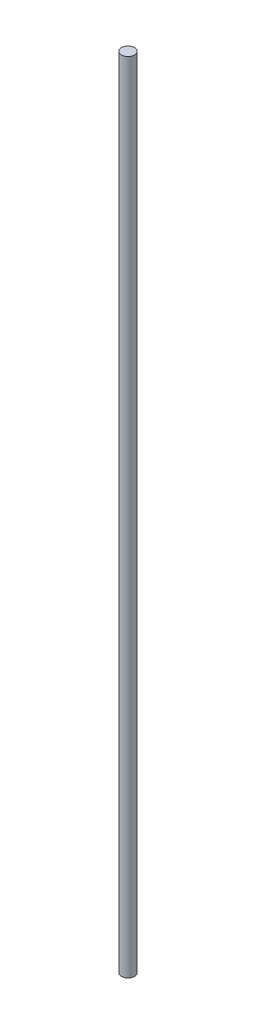
ISO-10303-21;
HEADER;
FILE_DESCRIPTION(('STEP AP214'),'2;1');
FILE_NAME('part.step','',(''),(''),'','','');
FILE_SCHEMA(('AUTOMOTIVE_DESIGN { 1 0 10303 214 1 1 1 1 }'));
ENDSEC;
DATA;
#1=APPLICATION_CONTEXT('core data for automotive mechanical design processes');
#2=APPLICATION_PROTOCOL_DEFINITION('international standard','automotive_design',2000,#1);
#3=PRODUCT_CONTEXT('',#1,'mechanical');
#4=PRODUCT('Part','Part','',(#3));
#5=PRODUCT_RELATED_PRODUCT_CATEGORY('part','',(#4));
#6=PRODUCT_DEFINITION_FORMATION('','',#4);
#7=PRODUCT_DEFINITION_CONTEXT('part definition',#1,'design');
#8=PRODUCT_DEFINITION('design','',#6,#7);
#9=PRODUCT_DEFINITION_SHAPE('','',#8);
#10=(LENGTH_UNIT() NAMED_UNIT(*) SI_UNIT(.MILLI.,.METRE.));
#11=(NAMED_UNIT(*) PLANE_ANGLE_UNIT() SI_UNIT($,.RADIAN.));
#12=(NAMED_UNIT(*) SI_UNIT($,.STERADIAN.) SOLID_ANGLE_UNIT());
#13=UNCERTAINTY_MEASURE_WITH_UNIT(LENGTH_MEASURE(1.E-05),#10,'distance_accuracy_value','');
#14=(GEOMETRIC_REPRESENTATION_CONTEXT(3) GLOBAL_UNCERTAINTY_ASSIGNED_CONTEXT((#13)) GLOBAL_UNIT_ASSIGNED_CONTEXT((#10,
#11,#12)) REPRESENTATION_CONTEXT('',''));
#15=CARTESIAN_POINT('',(0.,0.,0.));
#16=DIRECTION('',(0.,0.,1.));
#17=DIRECTION('',(1.,0.,0.));
#18=AXIS2_PLACEMENT_3D('',#15,#16,#17);
#19=CARTESIAN_POINT('',(0.,326.,0.));
#20=DIRECTION('',(0.,-1.,0.));
#21=DIRECTION('',(0.,0.,-1.));
#22=AXIS2_PLACEMENT_3D('',#19,#20,#21);
#23=CYLINDRICAL_SURFACE('',#22,2.65);
#24=CARTESIAN_POINT('',(0.,326.,0.));
#25=DIRECTION('',(0.,1.,0.));
#26=DIRECTION('',(0.,0.,1.));
#27=AXIS2_PLACEMENT_3D('',#24,#25,#26);
#28=CIRCLE('',#27,2.65);
#29=CARTESIAN_POINT('',(0.,326.,2.65));
#30=VERTEX_POINT('',#29);
#31=EDGE_CURVE('E10',#30,#30,#28,.T.);
#32=ORIENTED_EDGE('',*,*,#31,.F.);
#33=EDGE_LOOP('',(#32));
#34=FACE_BOUND('',#33,.T.);
#35=CARTESIAN_POINT('',(0.,0.,0.));
#36=DIRECTION('',(0.,1.,0.));
#37=DIRECTION('',(0.,0.,1.));
#38=AXIS2_PLACEMENT_3D('',#35,#36,#37);
#39=CIRCLE('',#38,2.65);
#40=CARTESIAN_POINT('',(0.,0.,2.65));
#41=VERTEX_POINT('',#40);
#42=EDGE_CURVE('E45',#41,#41,#39,.T.);
#43=ORIENTED_EDGE('',*,*,#42,.T.);
#44=EDGE_LOOP('',(#43));
#45=FACE_BOUND('',#44,.T.);
#46=ADVANCED_FACE('F42',(#34,#45),#23,.T.);
#47=CARTESIAN_POINT('',(0.,326.,0.));
#48=DIRECTION('',(0.,1.,0.));
#49=DIRECTION('',(0.,0.,1.));
#50=AXIS2_PLACEMENT_3D('',#47,#48,#49);
#51=PLANE('',#50);
#52=ORIENTED_EDGE('',*,*,#31,.T.);
#53=EDGE_LOOP('',(#52));
#54=FACE_BOUND('',#53,.T.);
#55=ADVANCED_FACE('F59',(#54),#51,.T.);
#56=CARTESIAN_POINT('',(0.,0.,0.));
#57=DIRECTION('',(0.,1.,0.));
#58=DIRECTION('',(0.,0.,1.));
#59=AXIS2_PLACEMENT_3D('',#56,#57,#58);
#60=PLANE('',#59);
#61=ORIENTED_EDGE('',*,*,#42,.F.);
#62=EDGE_LOOP('',(#61));
#63=FACE_BOUND('',#62,.T.);
#64=ADVANCED_FACE('F57',(#63),#60,.F.);
#65=CLOSED_SHELL('',(#46,#55,#64));
#66=MANIFOLD_SOLID_BREP('B2',#65);
#67=ADVANCED_BREP_SHAPE_REPRESENTATION('',(#18,#66),#14);
#68=SHAPE_DEFINITION_REPRESENTATION(#9,#67);
ENDSEC;
END-ISO-10303-21;
